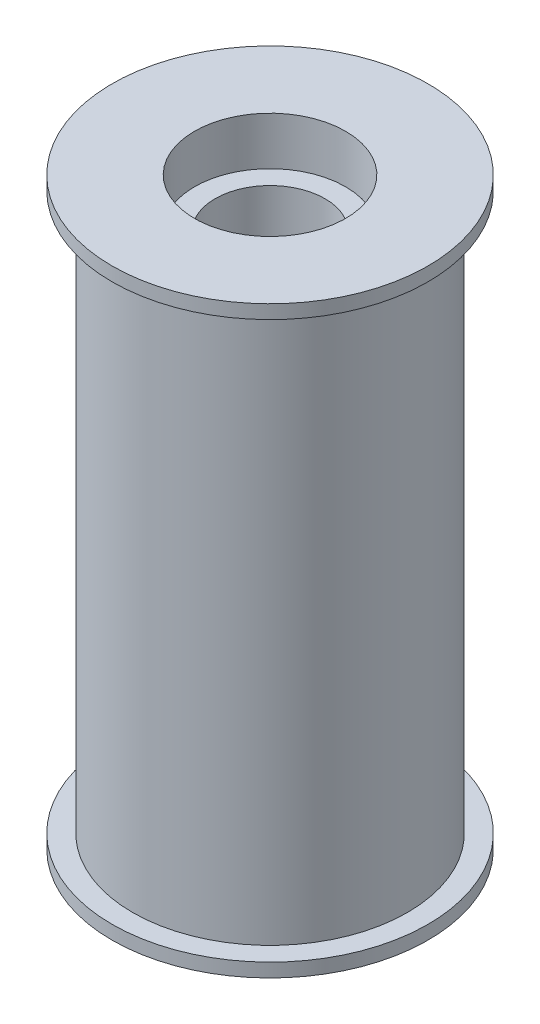
ISO-10303-21;
HEADER;
FILE_DESCRIPTION(('STEP AP214'),'2;1');
FILE_NAME('part.step','',(''),(''),'','','');
FILE_SCHEMA(('AUTOMOTIVE_DESIGN { 1 0 10303 214 1 1 1 1 }'));
ENDSEC;
DATA;
#1=APPLICATION_CONTEXT('core data for automotive mechanical design processes');
#2=APPLICATION_PROTOCOL_DEFINITION('international standard','automotive_design',2000,#1);
#3=PRODUCT_CONTEXT('',#1,'mechanical');
#4=PRODUCT('Part','Part','',(#3));
#5=PRODUCT_RELATED_PRODUCT_CATEGORY('part','',(#4));
#6=PRODUCT_DEFINITION_FORMATION('','',#4);
#7=PRODUCT_DEFINITION_CONTEXT('part definition',#1,'design');
#8=PRODUCT_DEFINITION('design','',#6,#7);
#9=PRODUCT_DEFINITION_SHAPE('','',#8);
#10=(LENGTH_UNIT() NAMED_UNIT(*) SI_UNIT(.MILLI.,.METRE.));
#11=(NAMED_UNIT(*) PLANE_ANGLE_UNIT() SI_UNIT($,.RADIAN.));
#12=(NAMED_UNIT(*) SI_UNIT($,.STERADIAN.) SOLID_ANGLE_UNIT());
#13=UNCERTAINTY_MEASURE_WITH_UNIT(LENGTH_MEASURE(1.E-05),#10,'distance_accuracy_value','');
#14=(GEOMETRIC_REPRESENTATION_CONTEXT(3) GLOBAL_UNCERTAINTY_ASSIGNED_CONTEXT((#13)) GLOBAL_UNIT_ASSIGNED_CONTEXT((#10,
#11,#12)) REPRESENTATION_CONTEXT('',''));
#15=CARTESIAN_POINT('',(0.,0.,0.));
#16=DIRECTION('',(0.,0.,1.));
#17=DIRECTION('',(1.,0.,0.));
#18=AXIS2_PLACEMENT_3D('',#15,#16,#17);
#19=CARTESIAN_POINT('',(0.,85.,0.));
#20=DIRECTION('',(0.,-1.,0.));
#21=DIRECTION('',(0.,0.,-1.));
#22=AXIS2_PLACEMENT_3D('',#19,#20,#21);
#23=CYLINDRICAL_SURFACE('',#22,20.);
#24=CARTESIAN_POINT('',(0.,2.,0.));
#25=DIRECTION('',(0.,-1.,0.));
#26=DIRECTION('',(0.,0.,-1.));
#27=AXIS2_PLACEMENT_3D('',#24,#25,#26);
#28=CIRCLE('',#27,20.);
#29=CARTESIAN_POINT('',(0.,2.,-20.));
#30=VERTEX_POINT('',#29);
#31=EDGE_CURVE('E36',#30,#30,#28,.T.);
#32=ORIENTED_EDGE('',*,*,#31,.F.);
#33=EDGE_LOOP('',(#32));
#34=FACE_BOUND('',#33,.T.);
#35=CARTESIAN_POINT('',(0.,83.,0.));
#36=DIRECTION('',(0.,1.,0.));
#37=DIRECTION('',(0.,0.,1.));
#38=AXIS2_PLACEMENT_3D('',#35,#36,#37);
#39=CIRCLE('',#38,20.);
#40=CARTESIAN_POINT('',(0.,83.,20.));
#41=VERTEX_POINT('',#40);
#42=EDGE_CURVE('E10',#41,#41,#39,.T.);
#43=ORIENTED_EDGE('',*,*,#42,.F.);
#44=EDGE_LOOP('',(#43));
#45=FACE_BOUND('',#44,.T.);
#46=ADVANCED_FACE('F30',(#34,#45),#23,.T.);
#47=CARTESIAN_POINT('',(0.,85.,0.));
#48=DIRECTION('',(0.,-1.,0.));
#49=DIRECTION('',(0.,0.,-1.));
#50=AXIS2_PLACEMENT_3D('',#47,#48,#49);
#51=CYLINDRICAL_SURFACE('',#50,8.);
#52=CARTESIAN_POINT('',(0.,7.00000000000001,0.));
#53=DIRECTION('',(0.,-1.,0.));
#54=DIRECTION('',(0.,0.,-1.));
#55=AXIS2_PLACEMENT_3D('',#52,#53,#54);
#56=CIRCLE('',#55,8.);
#57=CARTESIAN_POINT('',(0.,7.00000000000001,-8.));
#58=VERTEX_POINT('',#57);
#59=EDGE_CURVE('E40',#58,#58,#56,.F.);
#60=ORIENTED_EDGE('',*,*,#59,.F.);
#61=EDGE_LOOP('',(#60));
#62=FACE_BOUND('',#61,.T.);
#63=CARTESIAN_POINT('',(0.,78.,0.));
#64=DIRECTION('',(0.,1.,0.));
#65=DIRECTION('',(0.,0.,1.));
#66=AXIS2_PLACEMENT_3D('',#63,#64,#65);
#67=CIRCLE('',#66,8.);
#68=CARTESIAN_POINT('',(0.,78.,8.));
#69=VERTEX_POINT('',#68);
#70=EDGE_CURVE('E47',#69,#69,#67,.F.);
#71=ORIENTED_EDGE('',*,*,#70,.F.);
#72=EDGE_LOOP('',(#71));
#73=FACE_BOUND('',#72,.T.);
#74=ADVANCED_FACE('F87',(#62,#73),#51,.F.);
#75=CARTESIAN_POINT('',(0.,85.,0.));
#76=DIRECTION('',(0.,1.,0.));
#77=DIRECTION('',(0.,0.,1.));
#78=AXIS2_PLACEMENT_3D('',#75,#76,#77);
#79=PLANE('',#78);
#80=CARTESIAN_POINT('',(0.,85.,0.));
#81=DIRECTION('',(0.,-1.,0.));
#82=DIRECTION('',(0.,0.,-1.));
#83=AXIS2_PLACEMENT_3D('',#80,#81,#82);
#84=CIRCLE('',#83,11.);
#85=CARTESIAN_POINT('',(0.,85.,-11.));
#86=VERTEX_POINT('',#85);
#87=EDGE_CURVE('E56',#86,#86,#84,.T.);
#88=ORIENTED_EDGE('',*,*,#87,.T.);
#89=EDGE_LOOP('',(#88));
#90=FACE_BOUND('',#89,.T.);
#91=CARTESIAN_POINT('',(0.,85.,0.));
#92=DIRECTION('',(0.,1.,0.));
#93=DIRECTION('',(0.,0.,1.));
#94=AXIS2_PLACEMENT_3D('',#91,#92,#93);
#95=CIRCLE('',#94,22.9854337312928);
#96=CARTESIAN_POINT('',(0.,85.,22.9854337312928));
#97=VERTEX_POINT('',#96);
#98=EDGE_CURVE('E70',#97,#97,#95,.T.);
#99=ORIENTED_EDGE('',*,*,#98,.T.);
#100=EDGE_LOOP('',(#99));
#101=FACE_BOUND('',#100,.T.);
#102=ADVANCED_FACE('F74',(#90,#101),#79,.T.);
#103=CARTESIAN_POINT('',(0.,0.,0.));
#104=DIRECTION('',(0.,1.,0.));
#105=DIRECTION('',(0.,0.,1.));
#106=AXIS2_PLACEMENT_3D('',#103,#104,#105);
#107=PLANE('',#106);
#108=CARTESIAN_POINT('',(0.,0.,0.));
#109=DIRECTION('',(0.,-1.,0.));
#110=DIRECTION('',(0.,0.,-1.));
#111=AXIS2_PLACEMENT_3D('',#108,#109,#110);
#112=CIRCLE('',#111,11.);
#113=CARTESIAN_POINT('',(0.,0.,-11.));
#114=VERTEX_POINT('',#113);
#115=EDGE_CURVE('E49',#114,#114,#112,.T.);
#116=ORIENTED_EDGE('',*,*,#115,.F.);
#117=EDGE_LOOP('',(#116));
#118=FACE_BOUND('',#117,.T.);
#119=CARTESIAN_POINT('',(0.,0.,0.));
#120=DIRECTION('',(0.,1.,0.));
#121=DIRECTION('',(0.,0.,1.));
#122=AXIS2_PLACEMENT_3D('',#119,#120,#121);
#123=CIRCLE('',#122,22.9854337312928);
#124=CARTESIAN_POINT('',(0.,0.,22.9854337312928));
#125=VERTEX_POINT('',#124);
#126=EDGE_CURVE('E64',#125,#125,#123,.T.);
#127=ORIENTED_EDGE('',*,*,#126,.F.);
#128=EDGE_LOOP('',(#127));
#129=FACE_BOUND('',#128,.T.);
#130=ADVANCED_FACE('F98',(#118,#129),#107,.F.);
#131=CARTESIAN_POINT('',(0.,7.,0.));
#132=DIRECTION('',(0.,-1.,0.));
#133=DIRECTION('',(0.,0.,-1.));
#134=AXIS2_PLACEMENT_3D('',#131,#132,#133);
#135=PLANE('',#134);
#136=CARTESIAN_POINT('',(0.,7.,0.));
#137=DIRECTION('',(0.,-1.,0.));
#138=DIRECTION('',(0.,0.,-1.));
#139=AXIS2_PLACEMENT_3D('',#136,#137,#138);
#140=CIRCLE('',#139,11.);
#141=CARTESIAN_POINT('',(0.,7.,-11.));
#142=VERTEX_POINT('',#141);
#143=EDGE_CURVE('E44',#142,#142,#140,.T.);
#144=ORIENTED_EDGE('',*,*,#143,.T.);
#145=EDGE_LOOP('',(#144));
#146=FACE_BOUND('',#145,.T.);
#147=ORIENTED_EDGE('',*,*,#59,.T.);
#148=EDGE_LOOP('',(#147));
#149=FACE_BOUND('',#148,.T.);
#150=ADVANCED_FACE('F107',(#146,#149),#135,.T.);
#151=CARTESIAN_POINT('',(0.,7.,0.));
#152=DIRECTION('',(0.,-1.,0.));
#153=DIRECTION('',(0.,0.,-1.));
#154=AXIS2_PLACEMENT_3D('',#151,#152,#153);
#155=CYLINDRICAL_SURFACE('',#154,11.);
#156=ORIENTED_EDGE('',*,*,#143,.F.);
#157=EDGE_LOOP('',(#156));
#158=FACE_BOUND('',#157,.T.);
#159=ORIENTED_EDGE('',*,*,#115,.T.);
#160=EDGE_LOOP('',(#159));
#161=FACE_BOUND('',#160,.T.);
#162=ADVANCED_FACE('F104',(#158,#161),#155,.F.);
#163=CARTESIAN_POINT('',(0.,78.,0.));
#164=DIRECTION('',(0.,1.,0.));
#165=DIRECTION('',(0.,0.,-1.));
#166=AXIS2_PLACEMENT_3D('',#163,#164,#165);
#167=PLANE('',#166);
#168=CARTESIAN_POINT('',(0.,78.,0.));
#169=DIRECTION('',(0.,-1.,0.));
#170=DIRECTION('',(0.,0.,-1.));
#171=AXIS2_PLACEMENT_3D('',#168,#169,#170);
#172=CIRCLE('',#171,11.);
#173=CARTESIAN_POINT('',(0.,78.,-11.));
#174=VERTEX_POINT('',#173);
#175=EDGE_CURVE('E50',#174,#174,#172,.T.);
#176=ORIENTED_EDGE('',*,*,#175,.F.);
#177=EDGE_LOOP('',(#176));
#178=FACE_BOUND('',#177,.T.);
#179=ORIENTED_EDGE('',*,*,#70,.T.);
#180=EDGE_LOOP('',(#179));
#181=FACE_BOUND('',#180,.T.);
#182=ADVANCED_FACE('F128',(#178,#181),#167,.T.);
#183=CARTESIAN_POINT('',(0.,78.,0.));
#184=DIRECTION('',(0.,1.,0.));
#185=DIRECTION('',(0.,0.,1.));
#186=AXIS2_PLACEMENT_3D('',#183,#184,#185);
#187=CYLINDRICAL_SURFACE('',#186,11.);
#188=ORIENTED_EDGE('',*,*,#175,.T.);
#189=EDGE_LOOP('',(#188));
#190=FACE_BOUND('',#189,.T.);
#191=ORIENTED_EDGE('',*,*,#87,.F.);
#192=EDGE_LOOP('',(#191));
#193=FACE_BOUND('',#192,.T.);
#194=ADVANCED_FACE('F124',(#190,#193),#187,.F.);
#195=CARTESIAN_POINT('',(0.,2.,-19.9854337312928));
#196=DIRECTION('',(0.,-1.,0.));
#197=DIRECTION('',(0.,0.,-1.));
#198=AXIS2_PLACEMENT_3D('',#195,#196,#197);
#199=PLANE('',#198);
#200=ORIENTED_EDGE('',*,*,#31,.T.);
#201=EDGE_LOOP('',(#200));
#202=FACE_BOUND('',#201,.T.);
#203=CARTESIAN_POINT('',(0.,2.,0.));
#204=DIRECTION('',(0.,1.,0.));
#205=DIRECTION('',(0.,0.,1.));
#206=AXIS2_PLACEMENT_3D('',#203,#204,#205);
#207=CIRCLE('',#206,22.9854337312928);
#208=CARTESIAN_POINT('',(0.,2.,22.9854337312928));
#209=VERTEX_POINT('',#208);
#210=EDGE_CURVE('E59',#209,#209,#207,.T.);
#211=ORIENTED_EDGE('',*,*,#210,.T.);
#212=EDGE_LOOP('',(#211));
#213=FACE_BOUND('',#212,.T.);
#214=ADVANCED_FACE('F118',(#202,#213),#199,.F.);
#215=CARTESIAN_POINT('',(0.,85.,0.));
#216=DIRECTION('',(0.,1.,0.));
#217=DIRECTION('',(0.,0.,1.));
#218=AXIS2_PLACEMENT_3D('',#215,#216,#217);
#219=CYLINDRICAL_SURFACE('',#218,22.9854337312928);
#220=ORIENTED_EDGE('',*,*,#210,.F.);
#221=EDGE_LOOP('',(#220));
#222=FACE_BOUND('',#221,.T.);
#223=ORIENTED_EDGE('',*,*,#126,.T.);
#224=EDGE_LOOP('',(#223));
#225=FACE_BOUND('',#224,.T.);
#226=ADVANCED_FACE('F84',(#222,#225),#219,.T.);
#227=CARTESIAN_POINT('',(0.,83.,-19.9854337312928));
#228=DIRECTION('',(0.,1.,0.));
#229=DIRECTION('',(0.,0.,-1.));
#230=AXIS2_PLACEMENT_3D('',#227,#228,#229);
#231=PLANE('',#230);
#232=ORIENTED_EDGE('',*,*,#42,.T.);
#233=EDGE_LOOP('',(#232));
#234=FACE_BOUND('',#233,.T.);
#235=CARTESIAN_POINT('',(0.,83.,0.));
#236=DIRECTION('',(0.,1.,0.));
#237=DIRECTION('',(0.,0.,1.));
#238=AXIS2_PLACEMENT_3D('',#235,#236,#237);
#239=CIRCLE('',#238,22.9854337312928);
#240=CARTESIAN_POINT('',(0.,83.,22.9854337312928));
#241=VERTEX_POINT('',#240);
#242=EDGE_CURVE('E67',#241,#241,#239,.T.);
#243=ORIENTED_EDGE('',*,*,#242,.F.);
#244=EDGE_LOOP('',(#243));
#245=FACE_BOUND('',#244,.T.);
#246=ADVANCED_FACE('F78',(#234,#245),#231,.F.);
#247=CARTESIAN_POINT('',(0.,0.,0.));
#248=DIRECTION('',(0.,-1.,0.));
#249=DIRECTION('',(0.,0.,1.));
#250=AXIS2_PLACEMENT_3D('',#247,#248,#249);
#251=CYLINDRICAL_SURFACE('',#250,22.9854337312928);
#252=ORIENTED_EDGE('',*,*,#242,.T.);
#253=EDGE_LOOP('',(#252));
#254=FACE_BOUND('',#253,.T.);
#255=ORIENTED_EDGE('',*,*,#98,.F.);
#256=EDGE_LOOP('',(#255));
#257=FACE_BOUND('',#256,.T.);
#258=ADVANCED_FACE('F76',(#254,#257),#251,.T.);
#259=CLOSED_SHELL('',(#46,#74,#102,#130,#150,#162,#182,#194,#214,#226,#246,#258));
#260=MANIFOLD_SOLID_BREP('B2',#259);
#261=ADVANCED_BREP_SHAPE_REPRESENTATION('',(#18,#260),#14);
#262=SHAPE_DEFINITION_REPRESENTATION(#9,#261);
ENDSEC;
END-ISO-10303-21;
